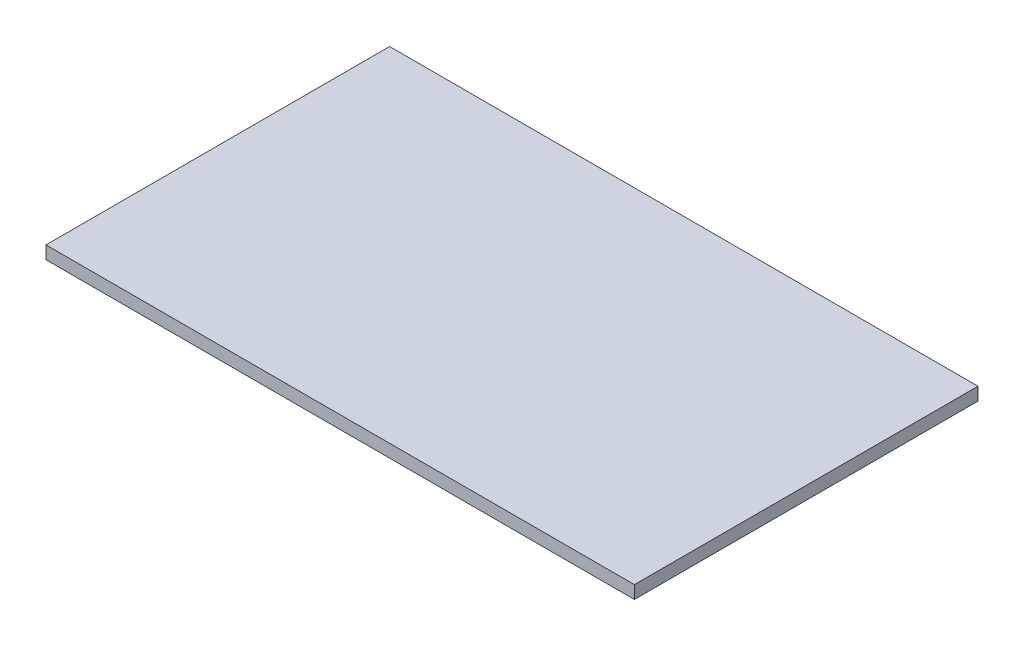
ISO-10303-21;
HEADER;
FILE_DESCRIPTION(('STEP AP214'),'2;1');
FILE_NAME('part.step','',(''),(''),'','','');
FILE_SCHEMA(('AUTOMOTIVE_DESIGN { 1 0 10303 214 1 1 1 1 }'));
ENDSEC;
DATA;
#1=APPLICATION_CONTEXT('core data for automotive mechanical design processes');
#2=APPLICATION_PROTOCOL_DEFINITION('international standard','automotive_design',2000,#1);
#3=PRODUCT_CONTEXT('',#1,'mechanical');
#4=PRODUCT('Part','Part','',(#3));
#5=PRODUCT_RELATED_PRODUCT_CATEGORY('part','',(#4));
#6=PRODUCT_DEFINITION_FORMATION('','',#4);
#7=PRODUCT_DEFINITION_CONTEXT('part definition',#1,'design');
#8=PRODUCT_DEFINITION('design','',#6,#7);
#9=PRODUCT_DEFINITION_SHAPE('','',#8);
#10=(LENGTH_UNIT() NAMED_UNIT(*) SI_UNIT(.MILLI.,.METRE.));
#11=(NAMED_UNIT(*) PLANE_ANGLE_UNIT() SI_UNIT($,.RADIAN.));
#12=(NAMED_UNIT(*) SI_UNIT($,.STERADIAN.) SOLID_ANGLE_UNIT());
#13=UNCERTAINTY_MEASURE_WITH_UNIT(LENGTH_MEASURE(1.E-05),#10,'distance_accuracy_value','');
#14=(GEOMETRIC_REPRESENTATION_CONTEXT(3) GLOBAL_UNCERTAINTY_ASSIGNED_CONTEXT((#13)) GLOBAL_UNIT_ASSIGNED_CONTEXT((#10,
#11,#12)) REPRESENTATION_CONTEXT('',''));
#15=CARTESIAN_POINT('',(0.,0.,0.));
#16=DIRECTION('',(0.,0.,1.));
#17=DIRECTION('',(1.,0.,0.));
#18=AXIS2_PLACEMENT_3D('',#15,#16,#17);
#19=CARTESIAN_POINT('',(-98.5616298546896,3.,-82.4002832232497));
#20=DIRECTION('',(1.,0.,0.));
#21=DIRECTION('',(0.,0.,-1.));
#22=AXIS2_PLACEMENT_3D('',#19,#20,#21);
#23=PLANE('',#22);
#24=DIRECTION('',(0.,0.,1.));
#25=VECTOR('',#24,1.);
#26=CARTESIAN_POINT('',(-98.5616298546896,0.,-82.4002832232497));
#27=LINE('',#26,#25);
#28=CARTESIAN_POINT('',(-98.5616298546896,0.,-82.4002832232497));
#29=VERTEX_POINT('',#28);
#30=CARTESIAN_POINT('',(-98.5616298546896,0.,-2.40028322324966));
#31=VERTEX_POINT('',#30);
#32=EDGE_CURVE('E96',#29,#31,#27,.T.);
#33=ORIENTED_EDGE('',*,*,#32,.T.);
#34=DIRECTION('',(0.,-1.,0.));
#35=VECTOR('',#34,1.);
#36=CARTESIAN_POINT('',(-98.5616298546896,3.,-2.40028322324966));
#37=LINE('',#36,#35);
#38=CARTESIAN_POINT('',(-98.5616298546896,3.,-2.40028322324966));
#39=VERTEX_POINT('',#38);
#40=EDGE_CURVE('E11',#39,#31,#37,.T.);
#41=ORIENTED_EDGE('',*,*,#40,.F.);
#42=DIRECTION('',(0.,0.,1.));
#43=VECTOR('',#42,1.);
#44=CARTESIAN_POINT('',(-98.5616298546896,3.,-82.4002832232497));
#45=LINE('',#44,#43);
#46=CARTESIAN_POINT('',(-98.5616298546896,3.,-82.4002832232497));
#47=VERTEX_POINT('',#46);
#48=EDGE_CURVE('E84',#47,#39,#45,.T.);
#49=ORIENTED_EDGE('',*,*,#48,.F.);
#50=DIRECTION('',(0.,-1.,0.));
#51=VECTOR('',#50,1.);
#52=CARTESIAN_POINT('',(-98.5616298546896,3.,-82.4002832232497));
#53=LINE('',#52,#51);
#54=EDGE_CURVE('E92',#47,#29,#53,.T.);
#55=ORIENTED_EDGE('',*,*,#54,.T.);
#56=EDGE_LOOP('',(#33,#41,#49,#55));
#57=FACE_BOUND('',#56,.T.);
#58=ADVANCED_FACE('F33',(#57),#23,.F.);
#59=CARTESIAN_POINT('',(-98.5616298546896,3.,-2.40028322324966));
#60=DIRECTION('',(0.,0.,-1.));
#61=DIRECTION('',(-1.,0.,0.));
#62=AXIS2_PLACEMENT_3D('',#59,#60,#61);
#63=PLANE('',#62);
#64=DIRECTION('',(1.,0.,0.));
#65=VECTOR('',#64,1.);
#66=CARTESIAN_POINT('',(-98.5616298546896,0.,-2.40028322324966));
#67=LINE('',#66,#65);
#68=CARTESIAN_POINT('',(38.4383701453104,0.,-2.40028322324966));
#69=VERTEX_POINT('',#68);
#70=EDGE_CURVE('E88',#31,#69,#67,.T.);
#71=ORIENTED_EDGE('',*,*,#70,.T.);
#72=DIRECTION('',(0.,-1.,0.));
#73=VECTOR('',#72,1.);
#74=CARTESIAN_POINT('',(38.4383701453104,3.,-2.40028322324966));
#75=LINE('',#74,#73);
#76=CARTESIAN_POINT('',(38.4383701453104,3.,-2.40028322324966));
#77=VERTEX_POINT('',#76);
#78=EDGE_CURVE('E41',#77,#69,#75,.T.);
#79=ORIENTED_EDGE('',*,*,#78,.F.);
#80=DIRECTION('',(1.,0.,0.));
#81=VECTOR('',#80,1.);
#82=CARTESIAN_POINT('',(-98.5616298546896,3.,-2.40028322324966));
#83=LINE('',#82,#81);
#84=EDGE_CURVE('E79',#39,#77,#83,.T.);
#85=ORIENTED_EDGE('',*,*,#84,.F.);
#86=ORIENTED_EDGE('',*,*,#40,.T.);
#87=EDGE_LOOP('',(#71,#79,#85,#86));
#88=FACE_BOUND('',#87,.T.);
#89=ADVANCED_FACE('F87',(#88),#63,.F.);
#90=CARTESIAN_POINT('',(38.4383701453104,3.,-82.4002832232497));
#91=DIRECTION('',(-1.,0.,0.));
#92=DIRECTION('',(0.,0.,1.));
#93=AXIS2_PLACEMENT_3D('',#90,#91,#92);
#94=PLANE('',#93);
#95=DIRECTION('',(0.,0.,-1.));
#96=VECTOR('',#95,1.);
#97=CARTESIAN_POINT('',(38.4383701453104,0.,-82.4002832232497));
#98=LINE('',#97,#96);
#99=CARTESIAN_POINT('',(38.4383701453104,0.,-82.4002832232497));
#100=VERTEX_POINT('',#99);
#101=EDGE_CURVE('E66',#69,#100,#98,.T.);
#102=ORIENTED_EDGE('',*,*,#101,.T.);
#103=DIRECTION('',(0.,-1.,0.));
#104=VECTOR('',#103,1.);
#105=CARTESIAN_POINT('',(38.4383701453104,3.,-82.4002832232497));
#106=LINE('',#105,#104);
#107=CARTESIAN_POINT('',(38.4383701453104,3.,-82.4002832232497));
#108=VERTEX_POINT('',#107);
#109=EDGE_CURVE('E89',#108,#100,#106,.T.);
#110=ORIENTED_EDGE('',*,*,#109,.F.);
#111=DIRECTION('',(0.,0.,-1.));
#112=VECTOR('',#111,1.);
#113=CARTESIAN_POINT('',(38.4383701453104,3.,-82.4002832232497));
#114=LINE('',#113,#112);
#115=EDGE_CURVE('E82',#77,#108,#114,.T.);
#116=ORIENTED_EDGE('',*,*,#115,.F.);
#117=ORIENTED_EDGE('',*,*,#78,.T.);
#118=EDGE_LOOP('',(#102,#110,#116,#117));
#119=FACE_BOUND('',#118,.T.);
#120=ADVANCED_FACE('F90',(#119),#94,.F.);
#121=CARTESIAN_POINT('',(-98.5616298546896,3.,-82.4002832232497));
#122=DIRECTION('',(0.,0.,1.));
#123=DIRECTION('',(1.,0.,0.));
#124=AXIS2_PLACEMENT_3D('',#121,#122,#123);
#125=PLANE('',#124);
#126=DIRECTION('',(-1.,0.,0.));
#127=VECTOR('',#126,1.);
#128=CARTESIAN_POINT('',(-98.5616298546896,0.,-82.4002832232497));
#129=LINE('',#128,#127);
#130=EDGE_CURVE('E72',#100,#29,#129,.T.);
#131=ORIENTED_EDGE('',*,*,#130,.T.);
#132=ORIENTED_EDGE('',*,*,#54,.F.);
#133=DIRECTION('',(-1.,0.,0.));
#134=VECTOR('',#133,1.);
#135=CARTESIAN_POINT('',(-98.5616298546896,3.,-82.4002832232497));
#136=LINE('',#135,#134);
#137=EDGE_CURVE('E49',#108,#47,#136,.T.);
#138=ORIENTED_EDGE('',*,*,#137,.F.);
#139=ORIENTED_EDGE('',*,*,#109,.T.);
#140=EDGE_LOOP('',(#131,#132,#138,#139));
#141=FACE_BOUND('',#140,.T.);
#142=ADVANCED_FACE('F103',(#141),#125,.F.);
#143=CARTESIAN_POINT('',(0.,3.,0.));
#144=DIRECTION('',(0.,1.,0.));
#145=DIRECTION('',(0.,0.,1.));
#146=AXIS2_PLACEMENT_3D('',#143,#144,#145);
#147=PLANE('',#146);
#148=ORIENTED_EDGE('',*,*,#48,.T.);
#149=ORIENTED_EDGE('',*,*,#84,.T.);
#150=ORIENTED_EDGE('',*,*,#115,.T.);
#151=ORIENTED_EDGE('',*,*,#137,.T.);
#152=EDGE_LOOP('',(#148,#149,#150,#151));
#153=FACE_BOUND('',#152,.T.);
#154=ADVANCED_FACE('F80',(#153),#147,.T.);
#155=CARTESIAN_POINT('',(0.,0.,0.));
#156=DIRECTION('',(0.,1.,0.));
#157=DIRECTION('',(0.,0.,1.));
#158=AXIS2_PLACEMENT_3D('',#155,#156,#157);
#159=PLANE('',#158);
#160=ORIENTED_EDGE('',*,*,#32,.F.);
#161=ORIENTED_EDGE('',*,*,#130,.F.);
#162=ORIENTED_EDGE('',*,*,#101,.F.);
#163=ORIENTED_EDGE('',*,*,#70,.F.);
#164=EDGE_LOOP('',(#160,#161,#162,#163));
#165=FACE_BOUND('',#164,.T.);
#166=ADVANCED_FACE('F106',(#165),#159,.F.);
#167=CLOSED_SHELL('',(#58,#89,#120,#142,#154,#166));
#168=MANIFOLD_SOLID_BREP('B2',#167);
#169=ADVANCED_BREP_SHAPE_REPRESENTATION('',(#18,#168),#14);
#170=SHAPE_DEFINITION_REPRESENTATION(#9,#169);
ENDSEC;
END-ISO-10303-21;
